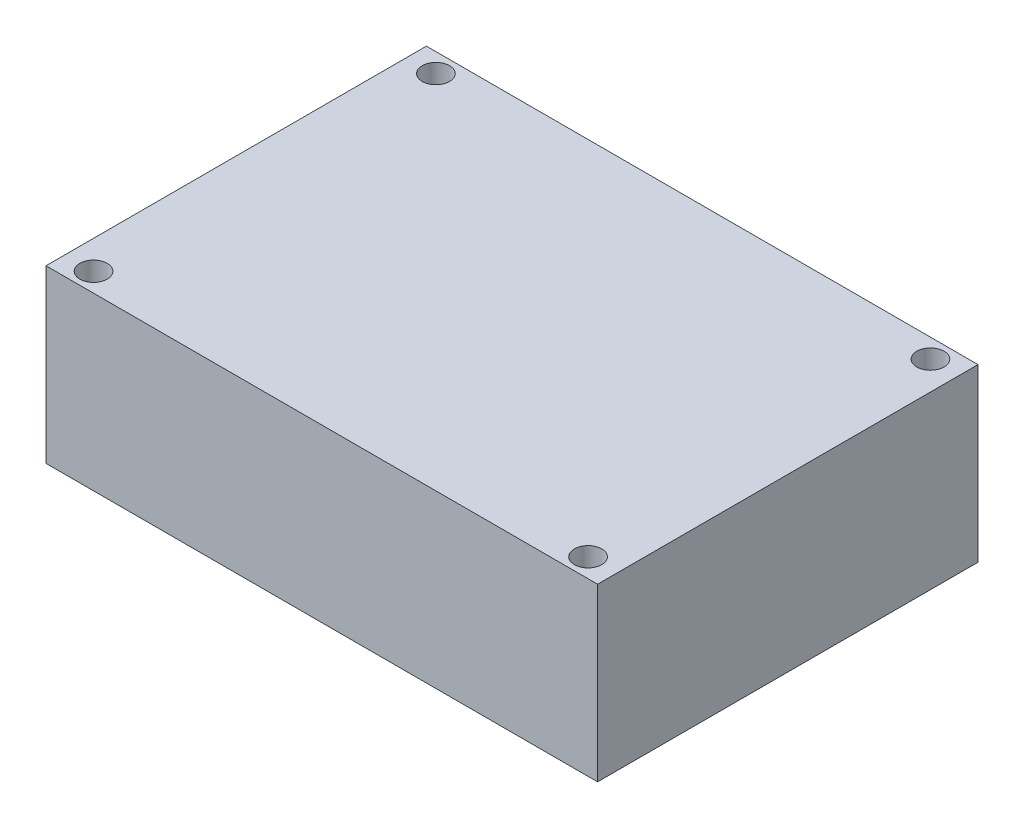
ISO-10303-21;
HEADER;
FILE_DESCRIPTION(('STEP AP214'),'2;1');
FILE_NAME('part.step','',(''),(''),'','','');
FILE_SCHEMA(('AUTOMOTIVE_DESIGN { 1 0 10303 214 1 1 1 1 }'));
ENDSEC;
DATA;
#1=APPLICATION_CONTEXT('core data for automotive mechanical design processes');
#2=APPLICATION_PROTOCOL_DEFINITION('international standard','automotive_design',2000,#1);
#3=PRODUCT_CONTEXT('',#1,'mechanical');
#4=PRODUCT('Part','Part','',(#3));
#5=PRODUCT_RELATED_PRODUCT_CATEGORY('part','',(#4));
#6=PRODUCT_DEFINITION_FORMATION('','',#4);
#7=PRODUCT_DEFINITION_CONTEXT('part definition',#1,'design');
#8=PRODUCT_DEFINITION('design','',#6,#7);
#9=PRODUCT_DEFINITION_SHAPE('','',#8);
#10=(LENGTH_UNIT() NAMED_UNIT(*) SI_UNIT(.MILLI.,.METRE.));
#11=(NAMED_UNIT(*) PLANE_ANGLE_UNIT() SI_UNIT($,.RADIAN.));
#12=(NAMED_UNIT(*) SI_UNIT($,.STERADIAN.) SOLID_ANGLE_UNIT());
#13=UNCERTAINTY_MEASURE_WITH_UNIT(LENGTH_MEASURE(1.E-05),#10,'distance_accuracy_value','');
#14=(GEOMETRIC_REPRESENTATION_CONTEXT(3) GLOBAL_UNCERTAINTY_ASSIGNED_CONTEXT((#13)) GLOBAL_UNIT_ASSIGNED_CONTEXT((#10,
#11,#12)) REPRESENTATION_CONTEXT('',''));
#15=CARTESIAN_POINT('',(0.,0.,0.));
#16=DIRECTION('',(0.,0.,1.));
#17=DIRECTION('',(1.,0.,0.));
#18=AXIS2_PLACEMENT_3D('',#15,#16,#17);
#19=CARTESIAN_POINT('',(0.,11.43,0.));
#20=DIRECTION('',(0.,-1.,0.));
#21=DIRECTION('',(0.,0.,-1.));
#22=AXIS2_PLACEMENT_3D('',#19,#20,#21);
#23=PLANE('',#22);
#24=CARTESIAN_POINT('',(33.02,11.43,22.86));
#25=DIRECTION('',(0.,1.,0.));
#26=DIRECTION('',(0.,0.,1.));
#27=AXIS2_PLACEMENT_3D('',#24,#25,#26);
#28=CIRCLE('',#27,1.8288);
#29=CARTESIAN_POINT('',(33.02,11.43,24.6888));
#30=VERTEX_POINT('',#29);
#31=EDGE_CURVE('E120',#30,#30,#28,.T.);
#32=ORIENTED_EDGE('',*,*,#31,.F.);
#33=EDGE_LOOP('',(#32));
#34=FACE_BOUND('',#33,.T.);
#35=CARTESIAN_POINT('',(-33.02,11.43,-22.86));
#36=DIRECTION('',(0.,1.,0.));
#37=DIRECTION('',(0.,0.,1.));
#38=AXIS2_PLACEMENT_3D('',#35,#36,#37);
#39=CIRCLE('',#38,1.8288);
#40=CARTESIAN_POINT('',(-33.02,11.43,-21.0312));
#41=VERTEX_POINT('',#40);
#42=EDGE_CURVE('E99',#41,#41,#39,.T.);
#43=ORIENTED_EDGE('',*,*,#42,.F.);
#44=EDGE_LOOP('',(#43));
#45=FACE_BOUND('',#44,.T.);
#46=DIRECTION('',(0.,0.,-1.));
#47=VECTOR('',#46,1.);
#48=CARTESIAN_POINT('',(36.83,11.43,25.4));
#49=LINE('',#48,#47);
#50=CARTESIAN_POINT('',(36.83,11.43,25.4));
#51=VERTEX_POINT('',#50);
#52=CARTESIAN_POINT('',(36.83,11.43,-25.4));
#53=VERTEX_POINT('',#52);
#54=EDGE_CURVE('E84',#51,#53,#49,.T.);
#55=ORIENTED_EDGE('',*,*,#54,.T.);
#56=DIRECTION('',(-1.,0.,0.));
#57=VECTOR('',#56,1.);
#58=CARTESIAN_POINT('',(-36.83,11.43,-25.4));
#59=LINE('',#58,#57);
#60=CARTESIAN_POINT('',(-36.83,11.43,-25.4));
#61=VERTEX_POINT('',#60);
#62=EDGE_CURVE('E79',#53,#61,#59,.T.);
#63=ORIENTED_EDGE('',*,*,#62,.T.);
#64=DIRECTION('',(0.,0.,1.));
#65=VECTOR('',#64,1.);
#66=CARTESIAN_POINT('',(-36.83,11.43,25.4));
#67=LINE('',#66,#65);
#68=CARTESIAN_POINT('',(-36.83,11.43,25.4));
#69=VERTEX_POINT('',#68);
#70=EDGE_CURVE('E82',#61,#69,#67,.T.);
#71=ORIENTED_EDGE('',*,*,#70,.T.);
#72=DIRECTION('',(1.,0.,0.));
#73=VECTOR('',#72,1.);
#74=CARTESIAN_POINT('',(-36.83,11.43,25.4));
#75=LINE('',#74,#73);
#76=EDGE_CURVE('E49',#69,#51,#75,.T.);
#77=ORIENTED_EDGE('',*,*,#76,.T.);
#78=EDGE_LOOP('',(#55,#63,#71,#77));
#79=FACE_BOUND('',#78,.T.);
#80=CARTESIAN_POINT('',(33.02,11.43,-22.86));
#81=DIRECTION('',(0.,1.,0.));
#82=DIRECTION('',(0.,0.,1.));
#83=AXIS2_PLACEMENT_3D('',#80,#81,#82);
#84=CIRCLE('',#83,1.8288);
#85=CARTESIAN_POINT('',(33.02,11.43,-21.0312));
#86=VERTEX_POINT('',#85);
#87=EDGE_CURVE('E114',#86,#86,#84,.T.);
#88=ORIENTED_EDGE('',*,*,#87,.F.);
#89=EDGE_LOOP('',(#88));
#90=FACE_BOUND('',#89,.T.);
#91=CARTESIAN_POINT('',(-33.02,11.43,22.86));
#92=DIRECTION('',(0.,1.,0.));
#93=DIRECTION('',(0.,0.,1.));
#94=AXIS2_PLACEMENT_3D('',#91,#92,#93);
#95=CIRCLE('',#94,1.8288);
#96=CARTESIAN_POINT('',(-33.02,11.43,24.6888));
#97=VERTEX_POINT('',#96);
#98=EDGE_CURVE('E126',#97,#97,#95,.T.);
#99=ORIENTED_EDGE('',*,*,#98,.F.);
#100=EDGE_LOOP('',(#99));
#101=FACE_BOUND('',#100,.T.);
#102=ADVANCED_FACE('F32',(#34,#45,#79,#90,#101),#23,.F.);
#103=CARTESIAN_POINT('',(0.,-11.43,0.));
#104=DIRECTION('',(0.,-1.,0.));
#105=DIRECTION('',(0.,0.,-1.));
#106=AXIS2_PLACEMENT_3D('',#103,#104,#105);
#107=PLANE('',#106);
#108=CARTESIAN_POINT('',(33.02,-11.43,22.86));
#109=DIRECTION('',(0.,1.,0.));
#110=DIRECTION('',(0.,0.,1.));
#111=AXIS2_PLACEMENT_3D('',#108,#109,#110);
#112=CIRCLE('',#111,1.8288);
#113=CARTESIAN_POINT('',(33.02,-11.43,24.6888));
#114=VERTEX_POINT('',#113);
#115=EDGE_CURVE('E123',#114,#114,#112,.T.);
#116=ORIENTED_EDGE('',*,*,#115,.T.);
#117=EDGE_LOOP('',(#116));
#118=FACE_BOUND('',#117,.T.);
#119=CARTESIAN_POINT('',(-33.02,-11.43,-22.86));
#120=DIRECTION('',(0.,1.,0.));
#121=DIRECTION('',(0.,0.,1.));
#122=AXIS2_PLACEMENT_3D('',#119,#120,#121);
#123=CIRCLE('',#122,1.8288);
#124=CARTESIAN_POINT('',(-33.02,-11.43,-21.0312));
#125=VERTEX_POINT('',#124);
#126=EDGE_CURVE('E111',#125,#125,#123,.T.);
#127=ORIENTED_EDGE('',*,*,#126,.T.);
#128=EDGE_LOOP('',(#127));
#129=FACE_BOUND('',#128,.T.);
#130=DIRECTION('',(0.,0.,-1.));
#131=VECTOR('',#130,1.);
#132=CARTESIAN_POINT('',(36.83,-11.43,25.4));
#133=LINE('',#132,#131);
#134=CARTESIAN_POINT('',(36.83,-11.43,25.4));
#135=VERTEX_POINT('',#134);
#136=CARTESIAN_POINT('',(36.83,-11.43,-25.4));
#137=VERTEX_POINT('',#136);
#138=EDGE_CURVE('E96',#135,#137,#133,.T.);
#139=ORIENTED_EDGE('',*,*,#138,.F.);
#140=DIRECTION('',(1.,0.,0.));
#141=VECTOR('',#140,1.);
#142=CARTESIAN_POINT('',(-36.83,-11.43,25.4));
#143=LINE('',#142,#141);
#144=CARTESIAN_POINT('',(-36.83,-11.43,25.4));
#145=VERTEX_POINT('',#144);
#146=EDGE_CURVE('E72',#145,#135,#143,.T.);
#147=ORIENTED_EDGE('',*,*,#146,.F.);
#148=DIRECTION('',(0.,0.,1.));
#149=VECTOR('',#148,1.);
#150=CARTESIAN_POINT('',(-36.83,-11.43,25.4));
#151=LINE('',#150,#149);
#152=CARTESIAN_POINT('',(-36.83,-11.43,-25.4));
#153=VERTEX_POINT('',#152);
#154=EDGE_CURVE('E66',#153,#145,#151,.T.);
#155=ORIENTED_EDGE('',*,*,#154,.F.);
#156=DIRECTION('',(-1.,0.,0.));
#157=VECTOR('',#156,1.);
#158=CARTESIAN_POINT('',(-36.83,-11.43,-25.4));
#159=LINE('',#158,#157);
#160=EDGE_CURVE('E88',#137,#153,#159,.T.);
#161=ORIENTED_EDGE('',*,*,#160,.F.);
#162=EDGE_LOOP('',(#139,#147,#155,#161));
#163=FACE_BOUND('',#162,.T.);
#164=CARTESIAN_POINT('',(33.02,-11.43,-22.86));
#165=DIRECTION('',(0.,1.,0.));
#166=DIRECTION('',(0.,0.,1.));
#167=AXIS2_PLACEMENT_3D('',#164,#165,#166);
#168=CIRCLE('',#167,1.8288);
#169=CARTESIAN_POINT('',(33.02,-11.43,-21.0312));
#170=VERTEX_POINT('',#169);
#171=EDGE_CURVE('E117',#170,#170,#168,.T.);
#172=ORIENTED_EDGE('',*,*,#171,.T.);
#173=EDGE_LOOP('',(#172));
#174=FACE_BOUND('',#173,.T.);
#175=CARTESIAN_POINT('',(-33.02,-11.43,22.86));
#176=DIRECTION('',(0.,1.,0.));
#177=DIRECTION('',(0.,0.,1.));
#178=AXIS2_PLACEMENT_3D('',#175,#176,#177);
#179=CIRCLE('',#178,1.8288);
#180=CARTESIAN_POINT('',(-33.02,-11.43,24.6888));
#181=VERTEX_POINT('',#180);
#182=EDGE_CURVE('E129',#181,#181,#179,.T.);
#183=ORIENTED_EDGE('',*,*,#182,.T.);
#184=EDGE_LOOP('',(#183));
#185=FACE_BOUND('',#184,.T.);
#186=ADVANCED_FACE('F107',(#118,#129,#163,#174,#185),#107,.T.);
#187=CARTESIAN_POINT('',(36.83,11.43,25.4));
#188=DIRECTION('',(-1.,0.,0.));
#189=DIRECTION('',(0.,0.,1.));
#190=AXIS2_PLACEMENT_3D('',#187,#188,#189);
#191=PLANE('',#190);
#192=ORIENTED_EDGE('',*,*,#138,.T.);
#193=DIRECTION('',(0.,-1.,0.));
#194=VECTOR('',#193,1.);
#195=CARTESIAN_POINT('',(36.83,11.43,-25.4));
#196=LINE('',#195,#194);
#197=EDGE_CURVE('E11',#53,#137,#196,.T.);
#198=ORIENTED_EDGE('',*,*,#197,.F.);
#199=ORIENTED_EDGE('',*,*,#54,.F.);
#200=DIRECTION('',(0.,-1.,0.));
#201=VECTOR('',#200,1.);
#202=CARTESIAN_POINT('',(36.83,11.43,25.4));
#203=LINE('',#202,#201);
#204=EDGE_CURVE('E92',#51,#135,#203,.T.);
#205=ORIENTED_EDGE('',*,*,#204,.T.);
#206=EDGE_LOOP('',(#192,#198,#199,#205));
#207=FACE_BOUND('',#206,.T.);
#208=ADVANCED_FACE('F34',(#207),#191,.F.);
#209=CARTESIAN_POINT('',(-36.83,11.43,-25.4));
#210=DIRECTION('',(0.,0.,1.));
#211=DIRECTION('',(1.,0.,0.));
#212=AXIS2_PLACEMENT_3D('',#209,#210,#211);
#213=PLANE('',#212);
#214=ORIENTED_EDGE('',*,*,#160,.T.);
#215=DIRECTION('',(0.,-1.,0.));
#216=VECTOR('',#215,1.);
#217=CARTESIAN_POINT('',(-36.83,11.43,-25.4));
#218=LINE('',#217,#216);
#219=EDGE_CURVE('E41',#61,#153,#218,.T.);
#220=ORIENTED_EDGE('',*,*,#219,.F.);
#221=ORIENTED_EDGE('',*,*,#62,.F.);
#222=ORIENTED_EDGE('',*,*,#197,.T.);
#223=EDGE_LOOP('',(#214,#220,#221,#222));
#224=FACE_BOUND('',#223,.T.);
#225=ADVANCED_FACE('F87',(#224),#213,.F.);
#226=CARTESIAN_POINT('',(-36.83,11.43,25.4));
#227=DIRECTION('',(1.,0.,0.));
#228=DIRECTION('',(0.,0.,-1.));
#229=AXIS2_PLACEMENT_3D('',#226,#227,#228);
#230=PLANE('',#229);
#231=ORIENTED_EDGE('',*,*,#154,.T.);
#232=DIRECTION('',(0.,-1.,0.));
#233=VECTOR('',#232,1.);
#234=CARTESIAN_POINT('',(-36.83,11.43,25.4));
#235=LINE('',#234,#233);
#236=EDGE_CURVE('E89',#69,#145,#235,.T.);
#237=ORIENTED_EDGE('',*,*,#236,.F.);
#238=ORIENTED_EDGE('',*,*,#70,.F.);
#239=ORIENTED_EDGE('',*,*,#219,.T.);
#240=EDGE_LOOP('',(#231,#237,#238,#239));
#241=FACE_BOUND('',#240,.T.);
#242=ADVANCED_FACE('F90',(#241),#230,.F.);
#243=CARTESIAN_POINT('',(-36.83,11.43,25.4));
#244=DIRECTION('',(0.,0.,-1.));
#245=DIRECTION('',(-1.,0.,0.));
#246=AXIS2_PLACEMENT_3D('',#243,#244,#245);
#247=PLANE('',#246);
#248=ORIENTED_EDGE('',*,*,#146,.T.);
#249=ORIENTED_EDGE('',*,*,#204,.F.);
#250=ORIENTED_EDGE('',*,*,#76,.F.);
#251=ORIENTED_EDGE('',*,*,#236,.T.);
#252=EDGE_LOOP('',(#248,#249,#250,#251));
#253=FACE_BOUND('',#252,.T.);
#254=ADVANCED_FACE('F104',(#253),#247,.F.);
#255=CARTESIAN_POINT('',(-33.02,11.43,-22.86));
#256=DIRECTION('',(0.,-1.,0.));
#257=DIRECTION('',(0.,0.,-1.));
#258=AXIS2_PLACEMENT_3D('',#255,#256,#257);
#259=CYLINDRICAL_SURFACE('',#258,1.8288);
#260=ORIENTED_EDGE('',*,*,#42,.T.);
#261=EDGE_LOOP('',(#260));
#262=FACE_BOUND('',#261,.T.);
#263=ORIENTED_EDGE('',*,*,#126,.F.);
#264=EDGE_LOOP('',(#263));
#265=FACE_BOUND('',#264,.T.);
#266=ADVANCED_FACE('F149',(#262,#265),#259,.F.);
#267=CARTESIAN_POINT('',(33.02,11.43,-22.86));
#268=DIRECTION('',(0.,-1.,0.));
#269=DIRECTION('',(0.,0.,-1.));
#270=AXIS2_PLACEMENT_3D('',#267,#268,#269);
#271=CYLINDRICAL_SURFACE('',#270,1.8288);
#272=ORIENTED_EDGE('',*,*,#87,.T.);
#273=EDGE_LOOP('',(#272));
#274=FACE_BOUND('',#273,.T.);
#275=ORIENTED_EDGE('',*,*,#171,.F.);
#276=EDGE_LOOP('',(#275));
#277=FACE_BOUND('',#276,.T.);
#278=ADVANCED_FACE('F195',(#274,#277),#271,.F.);
#279=CARTESIAN_POINT('',(33.02,11.43,22.86));
#280=DIRECTION('',(0.,-1.,0.));
#281=DIRECTION('',(0.,0.,-1.));
#282=AXIS2_PLACEMENT_3D('',#279,#280,#281);
#283=CYLINDRICAL_SURFACE('',#282,1.8288);
#284=ORIENTED_EDGE('',*,*,#31,.T.);
#285=EDGE_LOOP('',(#284));
#286=FACE_BOUND('',#285,.T.);
#287=ORIENTED_EDGE('',*,*,#115,.F.);
#288=EDGE_LOOP('',(#287));
#289=FACE_BOUND('',#288,.T.);
#290=ADVANCED_FACE('F203',(#286,#289),#283,.F.);
#291=CARTESIAN_POINT('',(-33.02,11.43,22.86));
#292=DIRECTION('',(0.,-1.,0.));
#293=DIRECTION('',(0.,0.,-1.));
#294=AXIS2_PLACEMENT_3D('',#291,#292,#293);
#295=CYLINDRICAL_SURFACE('',#294,1.8288);
#296=ORIENTED_EDGE('',*,*,#98,.T.);
#297=EDGE_LOOP('',(#296));
#298=FACE_BOUND('',#297,.T.);
#299=ORIENTED_EDGE('',*,*,#182,.F.);
#300=EDGE_LOOP('',(#299));
#301=FACE_BOUND('',#300,.T.);
#302=ADVANCED_FACE('F135',(#298,#301),#295,.F.);
#303=CLOSED_SHELL('',(#102,#186,#208,#225,#242,#254,#266,#278,#290,#302));
#304=MANIFOLD_SOLID_BREP('B2',#303);
#305=ADVANCED_BREP_SHAPE_REPRESENTATION('',(#18,#304),#14);
#306=SHAPE_DEFINITION_REPRESENTATION(#9,#305);
ENDSEC;
END-ISO-10303-21;
